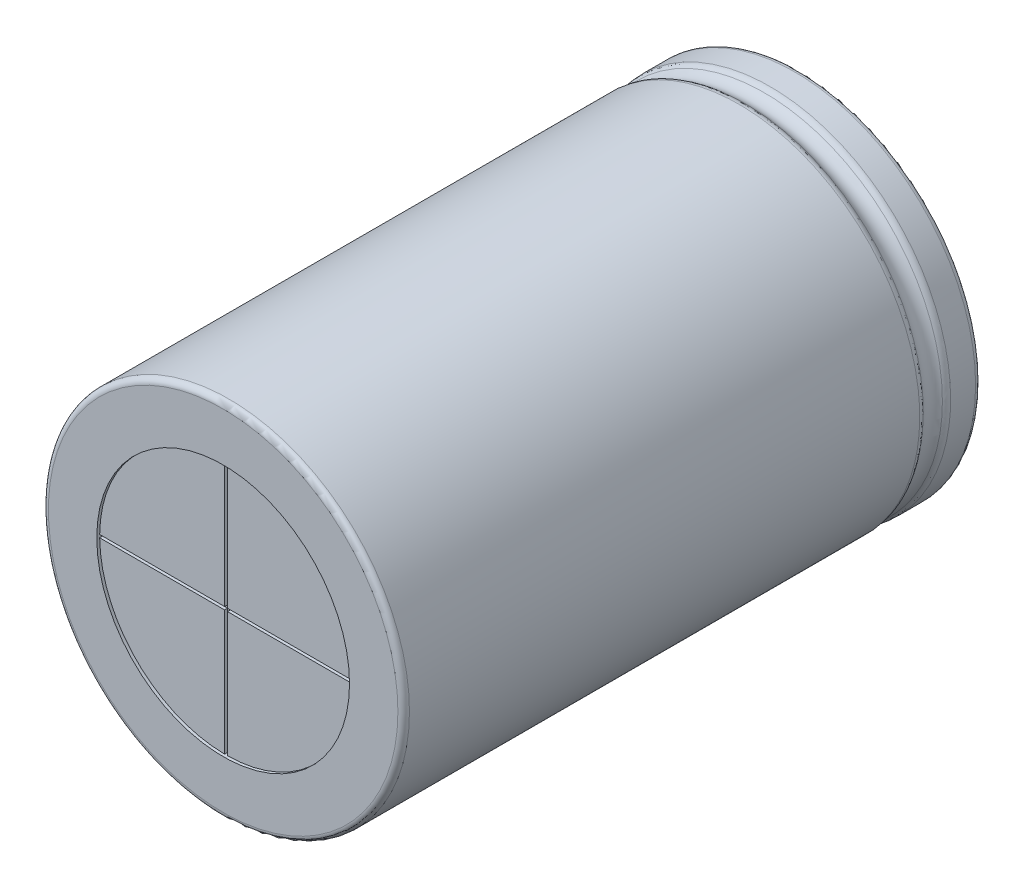
ISO-10303-21;
HEADER;
FILE_DESCRIPTION(('STEP AP214'),'2;1');
FILE_NAME('part.step','',(''),(''),'','','');
FILE_SCHEMA(('AUTOMOTIVE_DESIGN { 1 0 10303 214 1 1 1 1 }'));
ENDSEC;
DATA;
#1=APPLICATION_CONTEXT('core data for automotive mechanical design processes');
#2=APPLICATION_PROTOCOL_DEFINITION('international standard','automotive_design',2000,#1);
#3=PRODUCT_CONTEXT('',#1,'mechanical');
#4=PRODUCT('Part','Part','',(#3));
#5=PRODUCT_RELATED_PRODUCT_CATEGORY('part','',(#4));
#6=PRODUCT_DEFINITION_FORMATION('','',#4);
#7=PRODUCT_DEFINITION_CONTEXT('part definition',#1,'design');
#8=PRODUCT_DEFINITION('design','',#6,#7);
#9=PRODUCT_DEFINITION_SHAPE('','',#8);
#10=(LENGTH_UNIT() NAMED_UNIT(*) SI_UNIT(.MILLI.,.METRE.));
#11=(NAMED_UNIT(*) PLANE_ANGLE_UNIT() SI_UNIT($,.RADIAN.));
#12=(NAMED_UNIT(*) SI_UNIT($,.STERADIAN.) SOLID_ANGLE_UNIT());
#13=UNCERTAINTY_MEASURE_WITH_UNIT(LENGTH_MEASURE(1.E-05),#10,'distance_accuracy_value','');
#14=(GEOMETRIC_REPRESENTATION_CONTEXT(3) GLOBAL_UNCERTAINTY_ASSIGNED_CONTEXT((#13)) GLOBAL_UNIT_ASSIGNED_CONTEXT((#10,
#11,#12)) REPRESENTATION_CONTEXT('',''));
#15=CARTESIAN_POINT('',(0.,0.,0.));
#16=DIRECTION('',(0.,0.,1.));
#17=DIRECTION('',(1.,0.,0.));
#18=AXIS2_PLACEMENT_3D('',#15,#16,#17);
#19=CARTESIAN_POINT('',(71.,22.1,-0.4));
#20=DIRECTION('',(0.,0.,1.));
#21=DIRECTION('',(1.,0.,0.));
#22=AXIS2_PLACEMENT_3D('',#19,#20,#21);
#23=PLANE('',#22);
#24=CARTESIAN_POINT('',(71.,22.1,-0.4));
#25=DIRECTION('',(0.,0.,1.));
#26=DIRECTION('',(1.,0.,0.));
#27=AXIS2_PLACEMENT_3D('',#24,#25,#26);
#28=CIRCLE('',#27,0.3);
#29=CARTESIAN_POINT('',(71.3,22.1,-0.4));
#30=VERTEX_POINT('',#29);
#31=EDGE_CURVE('E425',#30,#30,#28,.T.);
#32=ORIENTED_EDGE('',*,*,#31,.F.);
#33=EDGE_LOOP('',(#32));
#34=FACE_BOUND('',#33,.T.);
#35=ADVANCED_FACE('F18',(#34),#23,.F.);
#36=CARTESIAN_POINT('',(66.,22.1,-0.5));
#37=DIRECTION('',(0.,0.,1.));
#38=DIRECTION('',(1.,0.,0.));
#39=AXIS2_PLACEMENT_3D('',#36,#37,#38);
#40=PLANE('',#39);
#41=CARTESIAN_POINT('',(66.,22.1,-0.5));
#42=DIRECTION('',(0.,0.,1.));
#43=DIRECTION('',(1.,0.,0.));
#44=AXIS2_PLACEMENT_3D('',#41,#42,#43);
#45=CIRCLE('',#44,0.3);
#46=CARTESIAN_POINT('',(66.3,22.1,-0.5));
#47=VERTEX_POINT('',#46);
#48=EDGE_CURVE('E422',#47,#47,#45,.T.);
#49=ORIENTED_EDGE('',*,*,#48,.F.);
#50=EDGE_LOOP('',(#49));
#51=FACE_BOUND('',#50,.T.);
#52=ADVANCED_FACE('F180',(#51),#40,.F.);
#53=CARTESIAN_POINT('',(71.,22.1,1.8));
#54=DIRECTION('',(0.,0.,1.));
#55=DIRECTION('',(1.,0.,0.));
#56=AXIS2_PLACEMENT_3D('',#53,#54,#55);
#57=CYLINDRICAL_SURFACE('',#56,0.3);
#58=ORIENTED_EDGE('',*,*,#31,.T.);
#59=EDGE_LOOP('',(#58));
#60=FACE_BOUND('',#59,.T.);
#61=CARTESIAN_POINT('',(71.,22.1,1.7));
#62=DIRECTION('',(0.,0.,1.));
#63=DIRECTION('',(1.,0.,0.));
#64=AXIS2_PLACEMENT_3D('',#61,#62,#63);
#65=CIRCLE('',#64,0.3);
#66=CARTESIAN_POINT('',(71.3,22.1,1.7));
#67=VERTEX_POINT('',#66);
#68=EDGE_CURVE('E419',#67,#67,#65,.F.);
#69=ORIENTED_EDGE('',*,*,#68,.T.);
#70=EDGE_LOOP('',(#69));
#71=FACE_BOUND('',#70,.T.);
#72=ADVANCED_FACE('F177',(#60,#71),#57,.T.);
#73=CARTESIAN_POINT('',(66.,22.1,1.8));
#74=DIRECTION('',(0.,0.,1.));
#75=DIRECTION('',(1.,0.,0.));
#76=AXIS2_PLACEMENT_3D('',#73,#74,#75);
#77=CYLINDRICAL_SURFACE('',#76,0.3);
#78=ORIENTED_EDGE('',*,*,#48,.T.);
#79=EDGE_LOOP('',(#78));
#80=FACE_BOUND('',#79,.T.);
#81=CARTESIAN_POINT('',(66.,22.1,1.7));
#82=DIRECTION('',(0.,0.,1.));
#83=DIRECTION('',(1.,0.,0.));
#84=AXIS2_PLACEMENT_3D('',#81,#82,#83);
#85=CIRCLE('',#84,0.3);
#86=CARTESIAN_POINT('',(66.3,22.1,1.7));
#87=VERTEX_POINT('',#86);
#88=EDGE_CURVE('E416',#87,#87,#85,.F.);
#89=ORIENTED_EDGE('',*,*,#88,.T.);
#90=EDGE_LOOP('',(#89));
#91=FACE_BOUND('',#90,.T.);
#92=ADVANCED_FACE('F173',(#80,#91),#77,.T.);
#93=CARTESIAN_POINT('',(68.5,22.1,1.7));
#94=DIRECTION('',(0.,0.,1.));
#95=DIRECTION('',(1.,0.,0.));
#96=AXIS2_PLACEMENT_3D('',#93,#94,#95);
#97=PLANE('',#96);
#98=ORIENTED_EDGE('',*,*,#88,.F.);
#99=EDGE_LOOP('',(#98));
#100=FACE_BOUND('',#99,.T.);
#101=ORIENTED_EDGE('',*,*,#68,.F.);
#102=EDGE_LOOP('',(#101));
#103=FACE_BOUND('',#102,.T.);
#104=CARTESIAN_POINT('',(68.5,22.1,1.7));
#105=DIRECTION('',(0.,0.,-1.));
#106=DIRECTION('',(-1.,0.,0.));
#107=AXIS2_PLACEMENT_3D('',#104,#105,#106);
#108=CIRCLE('',#107,4.375);
#109=CARTESIAN_POINT('',(64.125,22.1,1.7));
#110=VERTEX_POINT('',#109);
#111=EDGE_CURVE('E413',#110,#110,#108,.T.);
#112=ORIENTED_EDGE('',*,*,#111,.T.);
#113=EDGE_LOOP('',(#112));
#114=FACE_BOUND('',#113,.T.);
#115=ADVANCED_FACE('F169',(#100,#103,#114),#97,.F.);
#116=CARTESIAN_POINT('',(68.5,22.1,1.8));
#117=DIRECTION('',(0.,0.,-1.));
#118=DIRECTION('',(-1.,0.,0.));
#119=AXIS2_PLACEMENT_3D('',#116,#117,#118);
#120=CYLINDRICAL_SURFACE('',#119,4.375);
#121=CARTESIAN_POINT('',(68.5,22.1,1.5));
#122=DIRECTION('',(0.,0.,-1.));
#123=DIRECTION('',(-1.,0.,0.));
#124=AXIS2_PLACEMENT_3D('',#121,#122,#123);
#125=CIRCLE('',#124,4.375);
#126=CARTESIAN_POINT('',(64.125,22.1,1.5));
#127=VERTEX_POINT('',#126);
#128=EDGE_CURVE('E127',#127,#127,#125,.F.);
#129=ORIENTED_EDGE('',*,*,#128,.F.);
#130=EDGE_LOOP('',(#129));
#131=FACE_BOUND('',#130,.T.);
#132=ORIENTED_EDGE('',*,*,#111,.F.);
#133=EDGE_LOOP('',(#132));
#134=FACE_BOUND('',#133,.T.);
#135=ADVANCED_FACE('F166',(#131,#134),#120,.F.);
#136=CARTESIAN_POINT('',(68.5,22.1,21.3));
#137=DIRECTION('',(0.,0.,1.));
#138=DIRECTION('',(1.,0.,0.));
#139=AXIS2_PLACEMENT_3D('',#136,#137,#138);
#140=PLANE('',#139);
#141=DIRECTION('',(-1.,0.,0.));
#142=VECTOR('',#141,1.);
#143=CARTESIAN_POINT('',(68.45,22.15,21.3));
#144=LINE('',#143,#142);
#145=CARTESIAN_POINT('',(68.45,22.15,21.3));
#146=VERTEX_POINT('',#145);
#147=CARTESIAN_POINT('',(64.1252857236159,22.15,21.3));
#148=VERTEX_POINT('',#147);
#149=EDGE_CURVE('E133',#146,#148,#144,.T.);
#150=ORIENTED_EDGE('',*,*,#149,.T.);
#151=CARTESIAN_POINT('',(68.5,22.1,21.3));
#152=DIRECTION('',(0.,0.,1.));
#153=DIRECTION('',(1.,0.,0.));
#154=AXIS2_PLACEMENT_3D('',#151,#152,#153);
#155=CIRCLE('',#154,4.375);
#156=CARTESIAN_POINT('',(64.1252857236159,22.05,21.3));
#157=VERTEX_POINT('',#156);
#158=EDGE_CURVE('E385',#148,#157,#155,.T.);
#159=ORIENTED_EDGE('',*,*,#158,.T.);
#160=DIRECTION('',(1.,0.,0.));
#161=VECTOR('',#160,1.);
#162=CARTESIAN_POINT('',(55.95,22.05,21.3));
#163=LINE('',#162,#161);
#164=CARTESIAN_POINT('',(68.45,22.05,21.3));
#165=VERTEX_POINT('',#164);
#166=EDGE_CURVE('E92',#157,#165,#163,.T.);
#167=ORIENTED_EDGE('',*,*,#166,.T.);
#168=DIRECTION('',(0.,-1.,0.));
#169=VECTOR('',#168,1.);
#170=CARTESIAN_POINT('',(68.45,22.05,21.3));
#171=LINE('',#170,#169);
#172=CARTESIAN_POINT('',(68.45,17.7252857236159,21.3));
#173=VERTEX_POINT('',#172);
#174=EDGE_CURVE('E367',#165,#173,#171,.T.);
#175=ORIENTED_EDGE('',*,*,#174,.T.);
#176=CARTESIAN_POINT('',(68.5,22.1,21.3));
#177=DIRECTION('',(0.,0.,1.));
#178=DIRECTION('',(1.,0.,0.));
#179=AXIS2_PLACEMENT_3D('',#176,#177,#178);
#180=CIRCLE('',#179,4.375);
#181=CARTESIAN_POINT('',(68.55,17.7252857236159,21.3));
#182=VERTEX_POINT('',#181);
#183=EDGE_CURVE('E85',#173,#182,#180,.T.);
#184=ORIENTED_EDGE('',*,*,#183,.T.);
#185=DIRECTION('',(0.,1.,0.));
#186=VECTOR('',#185,1.);
#187=CARTESIAN_POINT('',(68.55,9.55,21.3));
#188=LINE('',#187,#186);
#189=CARTESIAN_POINT('',(68.55,22.05,21.3));
#190=VERTEX_POINT('',#189);
#191=EDGE_CURVE('E360',#182,#190,#188,.T.);
#192=ORIENTED_EDGE('',*,*,#191,.T.);
#193=DIRECTION('',(1.,0.,0.));
#194=VECTOR('',#193,1.);
#195=CARTESIAN_POINT('',(68.55,22.05,21.3));
#196=LINE('',#195,#194);
#197=CARTESIAN_POINT('',(72.8747142763841,22.05,21.3));
#198=VERTEX_POINT('',#197);
#199=EDGE_CURVE('E356',#190,#198,#196,.T.);
#200=ORIENTED_EDGE('',*,*,#199,.T.);
#201=CARTESIAN_POINT('',(68.5,22.1,21.3));
#202=DIRECTION('',(0.,0.,1.));
#203=DIRECTION('',(1.,0.,0.));
#204=AXIS2_PLACEMENT_3D('',#201,#202,#203);
#205=CIRCLE('',#204,4.375);
#206=CARTESIAN_POINT('',(72.8747142763841,22.15,21.3));
#207=VERTEX_POINT('',#206);
#208=EDGE_CURVE('E116',#198,#207,#205,.T.);
#209=ORIENTED_EDGE('',*,*,#208,.T.);
#210=DIRECTION('',(-1.,0.,0.));
#211=VECTOR('',#210,1.);
#212=CARTESIAN_POINT('',(81.05,22.15,21.3));
#213=LINE('',#212,#211);
#214=CARTESIAN_POINT('',(68.55,22.15,21.3));
#215=VERTEX_POINT('',#214);
#216=EDGE_CURVE('E108',#207,#215,#213,.T.);
#217=ORIENTED_EDGE('',*,*,#216,.T.);
#218=DIRECTION('',(0.,1.,0.));
#219=VECTOR('',#218,1.);
#220=CARTESIAN_POINT('',(68.55,22.15,21.3));
#221=LINE('',#220,#219);
#222=CARTESIAN_POINT('',(68.55,26.4747142763841,21.3));
#223=VERTEX_POINT('',#222);
#224=EDGE_CURVE('E113',#215,#223,#221,.T.);
#225=ORIENTED_EDGE('',*,*,#224,.T.);
#226=CARTESIAN_POINT('',(68.5,22.1,21.3));
#227=DIRECTION('',(0.,0.,1.));
#228=DIRECTION('',(1.,0.,0.));
#229=AXIS2_PLACEMENT_3D('',#226,#227,#228);
#230=CIRCLE('',#229,4.375);
#231=CARTESIAN_POINT('',(68.45,26.4747142763841,21.3));
#232=VERTEX_POINT('',#231);
#233=EDGE_CURVE('E409',#223,#232,#230,.T.);
#234=ORIENTED_EDGE('',*,*,#233,.T.);
#235=DIRECTION('',(0.,-1.,0.));
#236=VECTOR('',#235,1.);
#237=CARTESIAN_POINT('',(68.45,34.65,21.3));
#238=LINE('',#237,#236);
#239=EDGE_CURVE('E377',#232,#146,#238,.T.);
#240=ORIENTED_EDGE('',*,*,#239,.T.);
#241=EDGE_LOOP('',(#150,#159,#167,#175,#184,#192,#200,#209,#217,#225,#234,#240));
#242=FACE_BOUND('',#241,.T.);
#243=ADVANCED_FACE('F111',(#242),#140,.T.);
#244=CARTESIAN_POINT('',(68.5,22.1,1.5));
#245=DIRECTION('',(0.,0.,-1.));
#246=DIRECTION('',(-1.,0.,0.));
#247=AXIS2_PLACEMENT_3D('',#244,#245,#246);
#248=PLANE('',#247);
#249=CARTESIAN_POINT('',(68.5,22.1,1.5));
#250=DIRECTION('',(0.,0.,1.));
#251=DIRECTION('',(1.,0.,0.));
#252=AXIS2_PLACEMENT_3D('',#249,#250,#251);
#253=CIRCLE('',#252,6.05);
#254=CARTESIAN_POINT('',(74.55,22.1,1.5));
#255=VERTEX_POINT('',#254);
#256=EDGE_CURVE('E147',#255,#255,#253,.F.);
#257=ORIENTED_EDGE('',*,*,#256,.T.);
#258=EDGE_LOOP('',(#257));
#259=FACE_BOUND('',#258,.T.);
#260=ORIENTED_EDGE('',*,*,#128,.T.);
#261=EDGE_LOOP('',(#260));
#262=FACE_BOUND('',#261,.T.);
#263=ADVANCED_FACE('F153',(#259,#262),#248,.T.);
#264=CARTESIAN_POINT('',(68.55,22.15,21.4));
#265=DIRECTION('',(1.,0.,0.));
#266=DIRECTION('',(0.,1.,0.));
#267=AXIS2_PLACEMENT_3D('',#264,#265,#266);
#268=PLANE('',#267);
#269=ORIENTED_EDGE('',*,*,#224,.F.);
#270=DIRECTION('',(0.,0.,1.));
#271=VECTOR('',#270,1.);
#272=CARTESIAN_POINT('',(68.55,22.15,21.4));
#273=LINE('',#272,#271);
#274=CARTESIAN_POINT('',(68.55,22.15,21.4));
#275=VERTEX_POINT('',#274);
#276=EDGE_CURVE('E119',#215,#275,#273,.T.);
#277=ORIENTED_EDGE('',*,*,#276,.T.);
#278=DIRECTION('',(0.,1.,0.));
#279=VECTOR('',#278,1.);
#280=CARTESIAN_POINT('',(68.55,22.1,21.4));
#281=LINE('',#280,#279);
#282=CARTESIAN_POINT('',(68.55,26.4747142763841,21.4));
#283=VERTEX_POINT('',#282);
#284=EDGE_CURVE('E796',#283,#275,#281,.F.);
#285=ORIENTED_EDGE('',*,*,#284,.F.);
#286=DIRECTION('',(0.,0.,1.));
#287=VECTOR('',#286,1.);
#288=CARTESIAN_POINT('',(68.55,26.474714276384,21.4));
#289=LINE('',#288,#287);
#290=EDGE_CURVE('E126',#223,#283,#289,.T.);
#291=ORIENTED_EDGE('',*,*,#290,.F.);
#292=EDGE_LOOP('',(#269,#277,#285,#291));
#293=FACE_BOUND('',#292,.T.);
#294=ADVANCED_FACE('F123',(#293),#268,.F.);
#295=CARTESIAN_POINT('',(81.05,22.15,21.4));
#296=DIRECTION('',(0.,1.,0.));
#297=DIRECTION('',(-1.,0.,0.));
#298=AXIS2_PLACEMENT_3D('',#295,#296,#297);
#299=PLANE('',#298);
#300=ORIENTED_EDGE('',*,*,#216,.F.);
#301=DIRECTION('',(0.,0.,1.));
#302=VECTOR('',#301,1.);
#303=CARTESIAN_POINT('',(72.874714276384,22.15,21.4));
#304=LINE('',#303,#302);
#305=CARTESIAN_POINT('',(72.8747142763841,22.15,21.4));
#306=VERTEX_POINT('',#305);
#307=EDGE_CURVE('E120',#306,#207,#304,.F.);
#308=ORIENTED_EDGE('',*,*,#307,.F.);
#309=DIRECTION('',(1.,0.,0.));
#310=VECTOR('',#309,1.);
#311=CARTESIAN_POINT('',(68.5,22.15,21.4));
#312=LINE('',#311,#310);
#313=EDGE_CURVE('E131',#275,#306,#312,.T.);
#314=ORIENTED_EDGE('',*,*,#313,.F.);
#315=ORIENTED_EDGE('',*,*,#276,.F.);
#316=EDGE_LOOP('',(#300,#308,#314,#315));
#317=FACE_BOUND('',#316,.T.);
#318=ADVANCED_FACE('F129',(#317),#299,.F.);
#319=CARTESIAN_POINT('',(68.45,22.15,21.4));
#320=DIRECTION('',(0.,1.,0.));
#321=DIRECTION('',(-1.,0.,0.));
#322=AXIS2_PLACEMENT_3D('',#319,#320,#321);
#323=PLANE('',#322);
#324=ORIENTED_EDGE('',*,*,#149,.F.);
#325=DIRECTION('',(0.,0.,1.));
#326=VECTOR('',#325,1.);
#327=CARTESIAN_POINT('',(68.45,22.15,21.4));
#328=LINE('',#327,#326);
#329=CARTESIAN_POINT('',(68.45,22.15,21.4));
#330=VERTEX_POINT('',#329);
#331=EDGE_CURVE('E374',#146,#330,#328,.T.);
#332=ORIENTED_EDGE('',*,*,#331,.T.);
#333=DIRECTION('',(1.,0.,0.));
#334=VECTOR('',#333,1.);
#335=CARTESIAN_POINT('',(68.5,22.15,21.4));
#336=LINE('',#335,#334);
#337=CARTESIAN_POINT('',(64.1252857236159,22.15,21.4));
#338=VERTEX_POINT('',#337);
#339=EDGE_CURVE('E389',#338,#330,#336,.T.);
#340=ORIENTED_EDGE('',*,*,#339,.F.);
#341=DIRECTION('',(0.,0.,1.));
#342=VECTOR('',#341,1.);
#343=CARTESIAN_POINT('',(64.125285723616,22.15,21.4));
#344=LINE('',#343,#342);
#345=EDGE_CURVE('E135',#148,#338,#344,.T.);
#346=ORIENTED_EDGE('',*,*,#345,.F.);
#347=EDGE_LOOP('',(#324,#332,#340,#346));
#348=FACE_BOUND('',#347,.T.);
#349=ADVANCED_FACE('F390',(#348),#323,.F.);
#350=CARTESIAN_POINT('',(68.45,34.65,21.4));
#351=DIRECTION('',(-1.,0.,0.));
#352=DIRECTION('',(0.,-1.,0.));
#353=AXIS2_PLACEMENT_3D('',#350,#351,#352);
#354=PLANE('',#353);
#355=ORIENTED_EDGE('',*,*,#239,.F.);
#356=DIRECTION('',(0.,0.,1.));
#357=VECTOR('',#356,1.);
#358=CARTESIAN_POINT('',(68.45,26.474714276384,21.4));
#359=LINE('',#358,#357);
#360=CARTESIAN_POINT('',(68.45,26.4747142763841,21.4));
#361=VERTEX_POINT('',#360);
#362=EDGE_CURVE('E375',#361,#232,#359,.F.);
#363=ORIENTED_EDGE('',*,*,#362,.F.);
#364=DIRECTION('',(0.,1.,0.));
#365=VECTOR('',#364,1.);
#366=CARTESIAN_POINT('',(68.45,22.1,21.4));
#367=LINE('',#366,#365);
#368=EDGE_CURVE('E394',#330,#361,#367,.T.);
#369=ORIENTED_EDGE('',*,*,#368,.F.);
#370=ORIENTED_EDGE('',*,*,#331,.F.);
#371=EDGE_LOOP('',(#355,#363,#369,#370));
#372=FACE_BOUND('',#371,.T.);
#373=ADVANCED_FACE('F599',(#372),#354,.F.);
#374=CARTESIAN_POINT('',(55.95,22.05,21.4));
#375=DIRECTION('',(0.,-1.,0.));
#376=DIRECTION('',(1.,0.,0.));
#377=AXIS2_PLACEMENT_3D('',#374,#375,#376);
#378=PLANE('',#377);
#379=ORIENTED_EDGE('',*,*,#166,.F.);
#380=DIRECTION('',(0.,0.,1.));
#381=VECTOR('',#380,1.);
#382=CARTESIAN_POINT('',(64.125285723616,22.05,21.4));
#383=LINE('',#382,#381);
#384=CARTESIAN_POINT('',(64.1252857236159,22.05,21.4));
#385=VERTEX_POINT('',#384);
#386=EDGE_CURVE('E372',#385,#157,#383,.F.);
#387=ORIENTED_EDGE('',*,*,#386,.F.);
#388=DIRECTION('',(1.,0.,0.));
#389=VECTOR('',#388,1.);
#390=CARTESIAN_POINT('',(68.5,22.05,21.4));
#391=LINE('',#390,#389);
#392=CARTESIAN_POINT('',(68.45,22.05,21.4));
#393=VERTEX_POINT('',#392);
#394=EDGE_CURVE('E778',#393,#385,#391,.F.);
#395=ORIENTED_EDGE('',*,*,#394,.F.);
#396=DIRECTION('',(0.,0.,1.));
#397=VECTOR('',#396,1.);
#398=CARTESIAN_POINT('',(68.45,22.05,21.4));
#399=LINE('',#398,#397);
#400=EDGE_CURVE('E368',#393,#165,#399,.F.);
#401=ORIENTED_EDGE('',*,*,#400,.T.);
#402=EDGE_LOOP('',(#379,#387,#395,#401));
#403=FACE_BOUND('',#402,.T.);
#404=ADVANCED_FACE('F589',(#403),#378,.F.);
#405=CARTESIAN_POINT('',(68.45,22.05,21.4));
#406=DIRECTION('',(-1.,0.,0.));
#407=DIRECTION('',(0.,-1.,0.));
#408=AXIS2_PLACEMENT_3D('',#405,#406,#407);
#409=PLANE('',#408);
#410=ORIENTED_EDGE('',*,*,#174,.F.);
#411=ORIENTED_EDGE('',*,*,#400,.F.);
#412=DIRECTION('',(0.,1.,0.));
#413=VECTOR('',#412,1.);
#414=CARTESIAN_POINT('',(68.45,22.1,21.4));
#415=LINE('',#414,#413);
#416=CARTESIAN_POINT('',(68.45,17.7252857236159,21.4));
#417=VERTEX_POINT('',#416);
#418=EDGE_CURVE('E775',#417,#393,#415,.T.);
#419=ORIENTED_EDGE('',*,*,#418,.F.);
#420=DIRECTION('',(0.,0.,1.));
#421=VECTOR('',#420,1.);
#422=CARTESIAN_POINT('',(68.45,17.725285723616,21.4));
#423=LINE('',#422,#421);
#424=EDGE_CURVE('E365',#173,#417,#423,.T.);
#425=ORIENTED_EDGE('',*,*,#424,.F.);
#426=EDGE_LOOP('',(#410,#411,#419,#425));
#427=FACE_BOUND('',#426,.T.);
#428=ADVANCED_FACE('F580',(#427),#409,.F.);
#429=CARTESIAN_POINT('',(68.55,9.55,21.4));
#430=DIRECTION('',(1.,0.,0.));
#431=DIRECTION('',(0.,1.,0.));
#432=AXIS2_PLACEMENT_3D('',#429,#430,#431);
#433=PLANE('',#432);
#434=ORIENTED_EDGE('',*,*,#191,.F.);
#435=DIRECTION('',(0.,0.,1.));
#436=VECTOR('',#435,1.);
#437=CARTESIAN_POINT('',(68.55,17.725285723616,21.4));
#438=LINE('',#437,#436);
#439=CARTESIAN_POINT('',(68.55,17.7252857236159,21.4));
#440=VERTEX_POINT('',#439);
#441=EDGE_CURVE('E363',#440,#182,#438,.F.);
#442=ORIENTED_EDGE('',*,*,#441,.F.);
#443=DIRECTION('',(0.,1.,0.));
#444=VECTOR('',#443,1.);
#445=CARTESIAN_POINT('',(68.55,22.1,21.4));
#446=LINE('',#445,#444);
#447=CARTESIAN_POINT('',(68.55,22.05,21.4));
#448=VERTEX_POINT('',#447);
#449=EDGE_CURVE('E748',#448,#440,#446,.F.);
#450=ORIENTED_EDGE('',*,*,#449,.F.);
#451=DIRECTION('',(0.,0.,1.));
#452=VECTOR('',#451,1.);
#453=CARTESIAN_POINT('',(68.55,22.05,21.4));
#454=LINE('',#453,#452);
#455=EDGE_CURVE('E357',#448,#190,#454,.F.);
#456=ORIENTED_EDGE('',*,*,#455,.T.);
#457=EDGE_LOOP('',(#434,#442,#450,#456));
#458=FACE_BOUND('',#457,.T.);
#459=ADVANCED_FACE('F571',(#458),#433,.F.);
#460=CARTESIAN_POINT('',(68.55,22.05,21.4));
#461=DIRECTION('',(0.,-1.,0.));
#462=DIRECTION('',(1.,0.,0.));
#463=AXIS2_PLACEMENT_3D('',#460,#461,#462);
#464=PLANE('',#463);
#465=ORIENTED_EDGE('',*,*,#199,.F.);
#466=ORIENTED_EDGE('',*,*,#455,.F.);
#467=DIRECTION('',(1.,0.,0.));
#468=VECTOR('',#467,1.);
#469=CARTESIAN_POINT('',(68.5,22.05,21.4));
#470=LINE('',#469,#468);
#471=CARTESIAN_POINT('',(72.8747142763841,22.05,21.4));
#472=VERTEX_POINT('',#471);
#473=EDGE_CURVE('E314',#472,#448,#470,.F.);
#474=ORIENTED_EDGE('',*,*,#473,.F.);
#475=DIRECTION('',(0.,0.,1.));
#476=VECTOR('',#475,1.);
#477=CARTESIAN_POINT('',(72.874714276384,22.05,21.4));
#478=LINE('',#477,#476);
#479=EDGE_CURVE('E35',#198,#472,#478,.T.);
#480=ORIENTED_EDGE('',*,*,#479,.F.);
#481=EDGE_LOOP('',(#465,#466,#474,#480));
#482=FACE_BOUND('',#481,.T.);
#483=ADVANCED_FACE('F347',(#482),#464,.F.);
#484=CARTESIAN_POINT('',(68.5,22.1,1.7));
#485=DIRECTION('',(0.,0.,1.));
#486=DIRECTION('',(1.,0.,0.));
#487=AXIS2_PLACEMENT_3D('',#484,#485,#486);
#488=TOROIDAL_SURFACE('',#487,6.05,0.2);
#489=CARTESIAN_POINT('',(68.5,22.1,1.7));
#490=DIRECTION('',(0.,0.,1.));
#491=DIRECTION('',(1.,0.,0.));
#492=AXIS2_PLACEMENT_3D('',#489,#490,#491);
#493=CIRCLE('',#492,6.25);
#494=CARTESIAN_POINT('',(74.75,22.1,1.7));
#495=VERTEX_POINT('',#494);
#496=EDGE_CURVE('E274',#495,#495,#493,.T.);
#497=ORIENTED_EDGE('',*,*,#496,.F.);
#498=EDGE_LOOP('',(#497));
#499=FACE_BOUND('',#498,.T.);
#500=ORIENTED_EDGE('',*,*,#256,.F.);
#501=EDGE_LOOP('',(#500));
#502=FACE_BOUND('',#501,.T.);
#503=ADVANCED_FACE('F341',(#499,#502),#488,.T.);
#504=CARTESIAN_POINT('',(68.5,22.1,21.4));
#505=DIRECTION('',(0.,0.,1.));
#506=DIRECTION('',(1.,0.,0.));
#507=AXIS2_PLACEMENT_3D('',#504,#505,#506);
#508=PLANE('',#507);
#509=ORIENTED_EDGE('',*,*,#284,.T.);
#510=ORIENTED_EDGE('',*,*,#313,.T.);
#511=CARTESIAN_POINT('',(68.5,22.1,21.4));
#512=DIRECTION('',(0.,0.,-1.));
#513=DIRECTION('',(-1.,0.,0.));
#514=AXIS2_PLACEMENT_3D('',#511,#512,#513);
#515=CIRCLE('',#514,4.375);
#516=EDGE_CURVE('E397',#306,#283,#515,.F.);
#517=ORIENTED_EDGE('',*,*,#516,.T.);
#518=EDGE_LOOP('',(#509,#510,#517));
#519=FACE_BOUND('',#518,.T.);
#520=ADVANCED_FACE('F337',(#519),#508,.T.);
#521=CARTESIAN_POINT('',(68.5,22.1,21.4));
#522=DIRECTION('',(0.,0.,1.));
#523=DIRECTION('',(1.,0.,0.));
#524=AXIS2_PLACEMENT_3D('',#521,#522,#523);
#525=PLANE('',#524);
#526=ORIENTED_EDGE('',*,*,#339,.T.);
#527=ORIENTED_EDGE('',*,*,#368,.T.);
#528=CARTESIAN_POINT('',(68.5,22.1,21.4));
#529=DIRECTION('',(0.,0.,-1.));
#530=DIRECTION('',(-1.,0.,0.));
#531=AXIS2_PLACEMENT_3D('',#528,#529,#530);
#532=CIRCLE('',#531,4.375);
#533=EDGE_CURVE('E384',#361,#338,#532,.F.);
#534=ORIENTED_EDGE('',*,*,#533,.T.);
#535=EDGE_LOOP('',(#526,#527,#534));
#536=FACE_BOUND('',#535,.T.);
#537=ADVANCED_FACE('F333',(#536),#525,.T.);
#538=CARTESIAN_POINT('',(68.5,22.1,21.4));
#539=DIRECTION('',(0.,0.,1.));
#540=DIRECTION('',(1.,0.,0.));
#541=AXIS2_PLACEMENT_3D('',#538,#539,#540);
#542=PLANE('',#541);
#543=CARTESIAN_POINT('',(68.5,22.1,21.4));
#544=DIRECTION('',(0.,0.,-1.));
#545=DIRECTION('',(-1.,0.,0.));
#546=AXIS2_PLACEMENT_3D('',#543,#544,#545);
#547=CIRCLE('',#546,4.375);
#548=EDGE_CURVE('E396',#385,#417,#547,.F.);
#549=ORIENTED_EDGE('',*,*,#548,.T.);
#550=ORIENTED_EDGE('',*,*,#418,.T.);
#551=ORIENTED_EDGE('',*,*,#394,.T.);
#552=EDGE_LOOP('',(#549,#550,#551));
#553=FACE_BOUND('',#552,.T.);
#554=ADVANCED_FACE('F329',(#553),#542,.T.);
#555=CARTESIAN_POINT('',(68.5,22.1,21.4));
#556=DIRECTION('',(0.,0.,1.));
#557=DIRECTION('',(1.,0.,0.));
#558=AXIS2_PLACEMENT_3D('',#555,#556,#557);
#559=PLANE('',#558);
#560=CARTESIAN_POINT('',(68.5,22.1,21.4));
#561=DIRECTION('',(0.,0.,-1.));
#562=DIRECTION('',(-1.,0.,0.));
#563=AXIS2_PLACEMENT_3D('',#560,#561,#562);
#564=CIRCLE('',#563,4.375);
#565=EDGE_CURVE('E400',#440,#472,#564,.F.);
#566=ORIENTED_EDGE('',*,*,#565,.T.);
#567=ORIENTED_EDGE('',*,*,#473,.T.);
#568=ORIENTED_EDGE('',*,*,#449,.T.);
#569=EDGE_LOOP('',(#566,#567,#568));
#570=FACE_BOUND('',#569,.T.);
#571=ADVANCED_FACE('F325',(#570),#559,.T.);
#572=CARTESIAN_POINT('',(68.5,22.1,1.7));
#573=DIRECTION('',(0.,0.,1.));
#574=DIRECTION('',(1.,0.,0.));
#575=AXIS2_PLACEMENT_3D('',#572,#573,#574);
#576=CYLINDRICAL_SURFACE('',#575,6.25);
#577=ORIENTED_EDGE('',*,*,#496,.T.);
#578=EDGE_LOOP('',(#577));
#579=FACE_BOUND('',#578,.T.);
#580=CARTESIAN_POINT('',(74.75,22.1,2.564979142851));
#581=CARTESIAN_POINT('',(74.750000000001,24.864417237132,2.564979142851));
#582=CARTESIAN_POINT('',(73.43345029962,27.687680207852,2.564979142851));
#583=CARTESIAN_POINT('',(70.707510898034,29.833925513807,2.564979142851));
#584=CARTESIAN_POINT('',(66.989525682902,30.539508903953,2.564979142851));
#585=CARTESIAN_POINT('',(63.13812063855,29.142866187284,2.564979142851));
#586=CARTESIAN_POINT('',(60.55445477653,26.377607477066,2.564979142852));
#587=CARTESIAN_POINT('',(58.92000274163,22.100000000032,2.564979142851));
#588=CARTESIAN_POINT('',(60.554454776533,17.822392522879,2.564979142852));
#589=CARTESIAN_POINT('',(63.13812063855,15.057133812752,2.564979142851));
#590=CARTESIAN_POINT('',(66.989525682896,13.660491096029,2.564979142851));
#591=CARTESIAN_POINT('',(70.70751089804,14.366074486202,2.564979142851));
#592=CARTESIAN_POINT('',(73.433450299616,16.512319792144,2.564979142851));
#593=CARTESIAN_POINT('',(74.750000000002,19.335582762869,2.564979142851));
#594=CARTESIAN_POINT('',(74.75,22.1,2.564979142851));
#595=(BOUNDED_CURVE() B_SPLINE_CURVE(14,(#580,#581,#582,#583,#584,#585,#586,#587,#588,#589,#590,
#591,#592,#593,#594),.UNSPECIFIED.,.T.,.F.) B_SPLINE_CURVE_WITH_KNOTS((15,15),(0.,
39.269908169872),
.UNSPECIFIED.) CURVE() GEOMETRIC_REPRESENTATION_ITEM() RATIONAL_B_SPLINE_CURVE((1.,1.,1.,1.,
1.000000000001,0.999999999998,1.000000000003,0.999999999996,1.000000000004,0.999999999996,
1.000000000003,0.999999999999,1.,1.,1.)) REPRESENTATION_ITEM(''));
#596=CARTESIAN_POINT('',(74.75,22.1,2.564979142851));
#597=VERTEX_POINT('',#596);
#598=EDGE_CURVE('E310',#597,#597,#595,.T.);
#599=ORIENTED_EDGE('',*,*,#598,.F.);
#600=EDGE_LOOP('',(#599));
#601=FACE_BOUND('',#600,.T.);
#602=ADVANCED_FACE('F316',(#579,#601),#576,.T.);
#603=CARTESIAN_POINT('',(68.5,22.1,21.5));
#604=DIRECTION('',(0.,0.,-1.));
#605=DIRECTION('',(-1.,0.,0.));
#606=AXIS2_PLACEMENT_3D('',#603,#604,#605);
#607=CYLINDRICAL_SURFACE('',#606,4.375);
#608=CARTESIAN_POINT('',(68.5,22.1,21.5));
#609=DIRECTION('',(0.,0.,-1.));
#610=DIRECTION('',(-1.,0.,0.));
#611=AXIS2_PLACEMENT_3D('',#608,#609,#610);
#612=CIRCLE('',#611,4.375);
#613=CARTESIAN_POINT('',(64.125,22.1,21.5));
#614=VERTEX_POINT('',#613);
#615=EDGE_CURVE('E741',#614,#614,#612,.F.);
#616=ORIENTED_EDGE('',*,*,#615,.T.);
#617=EDGE_LOOP('',(#616));
#618=FACE_BOUND('',#617,.T.);
#619=ORIENTED_EDGE('',*,*,#479,.T.);
#620=ORIENTED_EDGE('',*,*,#565,.F.);
#621=ORIENTED_EDGE('',*,*,#441,.T.);
#622=ORIENTED_EDGE('',*,*,#183,.F.);
#623=ORIENTED_EDGE('',*,*,#424,.T.);
#624=ORIENTED_EDGE('',*,*,#548,.F.);
#625=ORIENTED_EDGE('',*,*,#386,.T.);
#626=ORIENTED_EDGE('',*,*,#158,.F.);
#627=ORIENTED_EDGE('',*,*,#345,.T.);
#628=ORIENTED_EDGE('',*,*,#533,.F.);
#629=ORIENTED_EDGE('',*,*,#362,.T.);
#630=ORIENTED_EDGE('',*,*,#233,.F.);
#631=ORIENTED_EDGE('',*,*,#290,.T.);
#632=ORIENTED_EDGE('',*,*,#516,.F.);
#633=ORIENTED_EDGE('',*,*,#307,.T.);
#634=ORIENTED_EDGE('',*,*,#208,.F.);
#635=EDGE_LOOP('',(#619,#620,#621,#622,#623,#624,#625,#626,#627,#628,#629,#630,#631,#632,#633,#634));
#636=FACE_BOUND('',#635,.T.);
#637=ADVANCED_FACE('F288',(#618,#636),#607,.F.);
#638=CARTESIAN_POINT('',(74.75,22.1,2.564979142851));
#639=CARTESIAN_POINT('',(74.750000000002,19.335582762869,2.564979142851));
#640=CARTESIAN_POINT('',(73.433450299616,16.512319792144,2.564979142851));
#641=CARTESIAN_POINT('',(70.70751089804,14.366074486202,2.564979142851));
#642=CARTESIAN_POINT('',(66.989525682896,13.660491096029,2.564979142851));
#643=CARTESIAN_POINT('',(63.13812063855,15.057133812752,2.564979142851));
#644=CARTESIAN_POINT('',(60.554454776533,17.822392522879,2.564979142852));
#645=CARTESIAN_POINT('',(58.92000274163,22.100000000032,2.564979142851));
#646=CARTESIAN_POINT('',(60.55445477653,26.377607477066,2.564979142852));
#647=CARTESIAN_POINT('',(63.13812063855,29.142866187284,2.564979142851));
#648=CARTESIAN_POINT('',(66.989525682902,30.539508903953,2.564979142851));
#649=CARTESIAN_POINT('',(70.707510898034,29.833925513807,2.564979142851));
#650=CARTESIAN_POINT('',(73.43345029962,27.687680207852,2.564979142851));
#651=CARTESIAN_POINT('',(74.750000000001,24.864417237132,2.564979142851));
#652=CARTESIAN_POINT('',(74.75,22.1,2.564979142851));
#653=CARTESIAN_POINT('',(74.75,22.1,2.682962690499));
#654=CARTESIAN_POINT('',(74.750000000003,19.335582762869,2.682962690499));
#655=CARTESIAN_POINT('',(73.433450299614,16.512319792147,2.682962690499));
#656=CARTESIAN_POINT('',(70.707510898044,14.366074486191,2.682962690499));
#657=CARTESIAN_POINT('',(66.9895256829,13.660491096053,2.682962690499));
#658=CARTESIAN_POINT('',(63.138120638527,15.05713381272,2.682962690499));
#659=CARTESIAN_POINT('',(60.554454776579,17.8223925229,2.6829626905));
#660=CARTESIAN_POINT('',(58.920002741572,22.100000000043,2.682962690499));
#661=CARTESIAN_POINT('',(60.55445477657,26.377607477027,2.6829626905));
#662=CARTESIAN_POINT('',(63.138120638534,29.142866187327,2.682962690499));
#663=CARTESIAN_POINT('',(66.989525682901,30.539508903922,2.682962690499));
#664=CARTESIAN_POINT('',(70.707510898039,29.833925513821,2.682962690499));
#665=CARTESIAN_POINT('',(73.433450299616,27.687680207848,2.682962690499));
#666=CARTESIAN_POINT('',(74.750000000002,24.864417237132,2.682962690499));
#667=CARTESIAN_POINT('',(74.75,22.1,2.682962690499));
#668=CARTESIAN_POINT('',(74.669629897377,22.1,2.769338405373));
#669=CARTESIAN_POINT('',(74.669629897379,19.371131002397,2.769338405373));
#670=CARTESIAN_POINT('',(73.370009994517,16.584172981219,2.769338405373));
#671=CARTESIAN_POINT('',(70.679124037655,14.465526708166,2.769338405373));
#672=CARTESIAN_POINT('',(67.008949199032,13.769016567482,2.769338405373));
#673=CARTESIAN_POINT('',(63.207070205685,15.147699553305,2.769338405372));
#674=CARTESIAN_POINT('',(60.656628262119,17.877399203132,2.769338405374));
#675=CARTESIAN_POINT('',(59.043193999695,22.100000000098,2.769338405371));
#676=CARTESIAN_POINT('',(60.656628262113,26.322600796693,2.769338405374));
#677=CARTESIAN_POINT('',(63.20707020569,29.052300446821,2.769338405372));
#678=CARTESIAN_POINT('',(67.008949199033,30.430983432445,2.769338405373));
#679=CARTESIAN_POINT('',(70.679124037651,29.734473291869,2.769338405373));
#680=CARTESIAN_POINT('',(73.370009994519,27.615827018768,2.769338405373));
#681=CARTESIAN_POINT('',(74.669629897378,24.828868997606,2.769338405373));
#682=CARTESIAN_POINT('',(74.669629897377,22.1,2.769338405373));
#683=(BOUNDED_SURFACE() B_SPLINE_SURFACE(2,14,((#638,#639,#640,#641,#642,#643,#644,#645,#646,
#647,#648,#649,#650,#651,#652),(#653,#654,#655,#656,#657,#658,#659,#660,#661,#662,#663,#664,
#665,#666,#667),(#668,#669,#670,#671,#672,#673,#674,#675,#676,#677,#678,#679,#680,#681,#682)),
.UNSPECIFIED.,.F.,.T.,.F.) B_SPLINE_SURFACE_WITH_KNOTS((3,3),(15,15),(0.,39.269908169872),(0.,
39.269908169872),.UNSPECIFIED.) GEOMETRIC_REPRESENTATION_ITEM() RATIONAL_B_SPLINE_SURFACE(((1.,
1.,1.,0.999999999999,1.000000000003,0.999999999996,1.000000000004,0.999999999996,1.000000000003,
0.999999999998,1.000000000001,1.,1.,1.,1.),(0.93061798229,0.930617982289,0.930617982291,
0.930617982287,0.930617982295,0.930617982282,0.9306179823,0.930617982279,0.930617982299,
0.930617982283,0.930617982293,0.930617982288,0.93061798229,0.93061798229,0.93061798229),(1.,1.,
1.,0.999999999999,1.000000000003,0.999999999996,1.000000000004,0.999999999996,1.000000000003,
0.999999999998,1.000000000001,1.,1.,1.,1.))) REPRESENTATION_ITEM('') SURFACE());
#684=CARTESIAN_POINT('',(74.669629897377,22.1,2.769338405373));
#685=CARTESIAN_POINT('',(74.669629897379,19.371131002397,2.769338405373));
#686=CARTESIAN_POINT('',(73.370009994517,16.584172981219,2.769338405373));
#687=CARTESIAN_POINT('',(70.679124037655,14.465526708166,2.769338405373));
#688=CARTESIAN_POINT('',(67.008949199032,13.769016567482,2.769338405373));
#689=CARTESIAN_POINT('',(63.207070205685,15.147699553305,2.769338405372));
#690=CARTESIAN_POINT('',(60.656628262119,17.877399203132,2.769338405374));
#691=CARTESIAN_POINT('',(59.043193999695,22.100000000098,2.769338405371));
#692=CARTESIAN_POINT('',(60.656628262113,26.322600796693,2.769338405374));
#693=CARTESIAN_POINT('',(63.20707020569,29.052300446821,2.769338405372));
#694=CARTESIAN_POINT('',(67.008949199033,30.430983432445,2.769338405373));
#695=CARTESIAN_POINT('',(70.679124037651,29.734473291869,2.769338405373));
#696=CARTESIAN_POINT('',(73.370009994519,27.615827018768,2.769338405373));
#697=CARTESIAN_POINT('',(74.669629897378,24.828868997606,2.769338405373));
#698=CARTESIAN_POINT('',(74.669629897377,22.1,2.769338405373));
#699=(BOUNDED_CURVE() B_SPLINE_CURVE(14,(#684,#685,#686,#687,#688,#689,#690,#691,#692,#693,#694,
#695,#696,#697,#698),.UNSPECIFIED.,.T.,.F.) B_SPLINE_CURVE_WITH_KNOTS((15,15),(0.,
39.269908169872),
.UNSPECIFIED.) CURVE() GEOMETRIC_REPRESENTATION_ITEM() RATIONAL_B_SPLINE_CURVE((1.,1.,1.,
0.999999999999,1.000000000003,0.999999999996,1.000000000004,0.999999999996,1.000000000003,
0.999999999998,1.000000000001,1.,1.,1.,1.)) REPRESENTATION_ITEM(''));
#700=CARTESIAN_POINT('',(74.669629897377,22.1,2.769338405373));
#701=VERTEX_POINT('',#700);
#702=EDGE_CURVE('E259',#701,#701,#699,.T.);
#703=ORIENTED_EDGE('',*,*,#702,.T.);
#704=EDGE_LOOP('',(#703));
#705=FACE_BOUND('',#704,.T.);
#706=ORIENTED_EDGE('',*,*,#598,.T.);
#707=EDGE_LOOP('',(#706));
#708=FACE_BOUND('',#707,.T.);
#709=ADVANCED_FACE('F276',(#705,#708),#683,.T.);
#710=CARTESIAN_POINT('',(68.5,22.1,21.5));
#711=DIRECTION('',(0.,0.,-1.));
#712=DIRECTION('',(-1.,0.,0.));
#713=AXIS2_PLACEMENT_3D('',#710,#711,#712);
#714=PLANE('',#713);
#715=ORIENTED_EDGE('',*,*,#615,.F.);
#716=EDGE_LOOP('',(#715));
#717=FACE_BOUND('',#716,.T.);
#718=CARTESIAN_POINT('',(68.5,22.1,21.5));
#719=DIRECTION('',(0.,0.,-1.));
#720=DIRECTION('',(1.,0.,0.));
#721=AXIS2_PLACEMENT_3D('',#718,#719,#720);
#722=CIRCLE('',#721,6.05);
#723=CARTESIAN_POINT('',(74.55,22.1,21.5));
#724=VERTEX_POINT('',#723);
#725=EDGE_CURVE('E807',#724,#724,#722,.T.);
#726=ORIENTED_EDGE('',*,*,#725,.F.);
#727=EDGE_LOOP('',(#726));
#728=FACE_BOUND('',#727,.T.);
#729=ADVANCED_FACE('F287',(#717,#728),#714,.F.);
#730=CARTESIAN_POINT('',(68.5,22.1,3.1));
#731=DIRECTION('',(0.,0.,1.));
#732=DIRECTION('',(1.,0.,0.));
#733=AXIS2_PLACEMENT_3D('',#730,#731,#732);
#734=TOROIDAL_SURFACE('',#733,6.525,0.485412195974);
#735=ORIENTED_EDGE('',*,*,#702,.F.);
#736=EDGE_LOOP('',(#735));
#737=FACE_BOUND('',#736,.T.);
#738=CARTESIAN_POINT('',(74.669629897377,22.1,3.430661594627));
#739=CARTESIAN_POINT('',(74.669629897377,24.828868997606,3.430661594627));
#740=CARTESIAN_POINT('',(73.370009994522,27.61582701877,3.430661594627));
#741=CARTESIAN_POINT('',(70.679124037644,29.734473291862,3.430661594627));
#742=CARTESIAN_POINT('',(67.008949199048,30.430983432457,3.430661594627));
#743=CARTESIAN_POINT('',(63.207070205664,29.052300446804,3.430661594628));
#744=CARTESIAN_POINT('',(60.656628262149,26.322600796711,3.430661594627));
#745=CARTESIAN_POINT('',(59.043193999654,22.100000000082,3.430661594628));
#746=CARTESIAN_POINT('',(60.656628262158,17.877399203143,3.430661594627));
#747=CARTESIAN_POINT('',(63.207070205656,15.147699553299,3.430661594628));
#748=CARTESIAN_POINT('',(67.008949199049,13.769016567484,3.430661594627));
#749=CARTESIAN_POINT('',(70.679124037647,14.465526708166,3.430661594627));
#750=CARTESIAN_POINT('',(73.37000999452,16.584172981219,3.430661594627));
#751=CARTESIAN_POINT('',(74.669629897378,19.371131002397,3.430661594627));
#752=CARTESIAN_POINT('',(74.669629897377,22.1,3.430661594627));
#753=(BOUNDED_CURVE() B_SPLINE_CURVE(14,(#738,#739,#740,#741,#742,#743,#744,#745,#746,#747,#748,
#749,#750,#751,#752),.UNSPECIFIED.,.T.,.F.) B_SPLINE_CURVE_WITH_KNOTS((15,15),(0.,
39.269908169872),
.UNSPECIFIED.) CURVE() GEOMETRIC_REPRESENTATION_ITEM() RATIONAL_B_SPLINE_CURVE((1.,1.,1.,1.,
1.000000000001,0.999999999998,1.000000000003,0.999999999996,1.000000000004,0.999999999996,
1.000000000003,0.999999999999,1.,1.,1.)) REPRESENTATION_ITEM(''));
#754=CARTESIAN_POINT('',(74.669629897377,22.1,3.430661594627));
#755=VERTEX_POINT('',#754);
#756=EDGE_CURVE('E808',#755,#755,#753,.T.);
#757=ORIENTED_EDGE('',*,*,#756,.F.);
#758=EDGE_LOOP('',(#757));
#759=FACE_BOUND('',#758,.T.);
#760=ADVANCED_FACE('F239',(#737,#759),#734,.F.);
#761=CARTESIAN_POINT('',(68.5,22.1,21.3));
#762=DIRECTION('',(0.,0.,1.));
#763=DIRECTION('',(1.,0.,0.));
#764=AXIS2_PLACEMENT_3D('',#761,#762,#763);
#765=TOROIDAL_SURFACE('',#764,6.05,0.2);
#766=ORIENTED_EDGE('',*,*,#725,.T.);
#767=EDGE_LOOP('',(#766));
#768=FACE_BOUND('',#767,.T.);
#769=CARTESIAN_POINT('',(68.5,22.1,21.3));
#770=DIRECTION('',(0.,0.,1.));
#771=DIRECTION('',(1.,0.,0.));
#772=AXIS2_PLACEMENT_3D('',#769,#770,#771);
#773=CIRCLE('',#772,6.25);
#774=CARTESIAN_POINT('',(74.75,22.1,21.3));
#775=VERTEX_POINT('',#774);
#776=EDGE_CURVE('E27',#775,#775,#773,.F.);
#777=ORIENTED_EDGE('',*,*,#776,.F.);
#778=EDGE_LOOP('',(#777));
#779=FACE_BOUND('',#778,.T.);
#780=ADVANCED_FACE('F199',(#768,#779),#765,.T.);
#781=CARTESIAN_POINT('',(74.669629897377,22.1,3.430661594627));
#782=CARTESIAN_POINT('',(74.669629897378,19.371131002397,3.430661594627));
#783=CARTESIAN_POINT('',(73.37000999452,16.584172981219,3.430661594627));
#784=CARTESIAN_POINT('',(70.679124037647,14.465526708166,3.430661594627));
#785=CARTESIAN_POINT('',(67.008949199049,13.769016567484,3.430661594627));
#786=CARTESIAN_POINT('',(63.207070205656,15.147699553299,3.430661594628));
#787=CARTESIAN_POINT('',(60.656628262158,17.877399203143,3.430661594627));
#788=CARTESIAN_POINT('',(59.043193999654,22.100000000082,3.430661594628));
#789=CARTESIAN_POINT('',(60.656628262149,26.322600796711,3.430661594627));
#790=CARTESIAN_POINT('',(63.207070205664,29.052300446804,3.430661594628));
#791=CARTESIAN_POINT('',(67.008949199048,30.430983432457,3.430661594627));
#792=CARTESIAN_POINT('',(70.679124037644,29.734473291862,3.430661594627));
#793=CARTESIAN_POINT('',(73.370009994522,27.61582701877,3.430661594627));
#794=CARTESIAN_POINT('',(74.669629897377,24.828868997606,3.430661594627));
#795=CARTESIAN_POINT('',(74.669629897377,22.1,3.430661594627));
#796=CARTESIAN_POINT('',(74.75,22.1,3.517037309501));
#797=CARTESIAN_POINT('',(74.750000000002,19.335582762869,3.517037309501));
#798=CARTESIAN_POINT('',(73.433450299615,16.51231979215,3.517037309501));
#799=CARTESIAN_POINT('',(70.70751089804,14.366074486183,3.517037309501));
#800=CARTESIAN_POINT('',(66.989525682909,13.66049109607,3.517037309501));
#801=CARTESIAN_POINT('',(63.13812063851,15.057133812693,3.517037309501));
#802=CARTESIAN_POINT('',(60.554454776602,17.822392522935,3.517037309501));
#803=CARTESIAN_POINT('',(58.920002741546,22.100000000007,3.5170373095));
#804=CARTESIAN_POINT('',(60.554454776593,26.377607477058,3.517037309501));
#805=CARTESIAN_POINT('',(63.138120638517,29.142866187306,3.5170373095));
#806=CARTESIAN_POINT('',(66.989525682911,30.539508903934,3.517037309501));
#807=CARTESIAN_POINT('',(70.707510898035,29.833925513815,3.517037309501));
#808=CARTESIAN_POINT('',(73.433450299618,27.687680207849,3.517037309501));
#809=CARTESIAN_POINT('',(74.750000000001,24.864417237132,3.517037309501));
#810=CARTESIAN_POINT('',(74.75,22.1,3.517037309501));
#811=CARTESIAN_POINT('',(74.75,22.1,3.635020857149));
#812=CARTESIAN_POINT('',(74.750000000001,19.335582762869,3.635020857149));
#813=CARTESIAN_POINT('',(73.433450299618,16.512319792146,3.635020857149));
#814=CARTESIAN_POINT('',(70.707510898034,14.366074486196,3.635020857149));
#815=CARTESIAN_POINT('',(66.989525682908,13.66049109604,3.635020857149));
#816=CARTESIAN_POINT('',(63.138120638532,15.057133812734,3.635020857149));
#817=CARTESIAN_POINT('',(60.554454776554,17.822392522901,3.635020857149));
#818=CARTESIAN_POINT('',(58.92000274161,22.10000000001,3.635020857149));
#819=CARTESIAN_POINT('',(60.554454776547,26.377607477085,3.635020857149));
#820=CARTESIAN_POINT('',(63.138120638538,29.142866187271,3.635020857148));
#821=CARTESIAN_POINT('',(66.989525682909,30.53950890396,3.635020857149));
#822=CARTESIAN_POINT('',(70.70751089803,29.833925513804,3.635020857149));
#823=CARTESIAN_POINT('',(73.433450299621,27.687680207852,3.635020857149));
#824=CARTESIAN_POINT('',(74.750000000001,24.864417237132,3.635020857149));
#825=CARTESIAN_POINT('',(74.75,22.1,3.635020857149));
#826=(BOUNDED_SURFACE() B_SPLINE_SURFACE(2,14,((#781,#782,#783,#784,#785,#786,#787,#788,#789,
#790,#791,#792,#793,#794,#795),(#796,#797,#798,#799,#800,#801,#802,#803,#804,#805,#806,#807,
#808,#809,#810),(#811,#812,#813,#814,#815,#816,#817,#818,#819,#820,#821,#822,#823,#824,#825)),
.UNSPECIFIED.,.F.,.T.,.F.) B_SPLINE_SURFACE_WITH_KNOTS((3,3),(15,15),(0.,39.269908169872),(0.,
39.269908169872),.UNSPECIFIED.) GEOMETRIC_REPRESENTATION_ITEM() RATIONAL_B_SPLINE_SURFACE(((1.,
1.,1.,0.999999999999,1.000000000003,0.999999999996,1.000000000004,0.999999999996,1.000000000003,
0.999999999998,1.000000000001,1.,1.,1.,1.),(0.93061798229,0.930617982289,0.930617982291,
0.930617982287,0.930617982295,0.930617982282,0.9306179823,0.930617982279,0.930617982299,
0.930617982283,0.930617982293,0.930617982288,0.93061798229,0.93061798229,0.93061798229),(1.,1.,
1.,0.999999999999,1.000000000003,0.999999999996,1.000000000004,0.999999999996,1.000000000003,
0.999999999998,1.000000000001,1.,1.,1.,1.))) REPRESENTATION_ITEM('') SURFACE());
#827=CARTESIAN_POINT('',(74.75,22.1,3.635020857149));
#828=CARTESIAN_POINT('',(74.750000000001,19.335582762869,3.635020857149));
#829=CARTESIAN_POINT('',(73.433450299618,16.512319792146,3.635020857149));
#830=CARTESIAN_POINT('',(70.707510898034,14.366074486196,3.635020857149));
#831=CARTESIAN_POINT('',(66.989525682908,13.66049109604,3.635020857149));
#832=CARTESIAN_POINT('',(63.138120638532,15.057133812734,3.635020857149));
#833=CARTESIAN_POINT('',(60.554454776554,17.822392522901,3.635020857149));
#834=CARTESIAN_POINT('',(58.92000274161,22.10000000001,3.635020857149));
#835=CARTESIAN_POINT('',(60.554454776547,26.377607477085,3.635020857149));
#836=CARTESIAN_POINT('',(63.138120638538,29.142866187271,3.635020857148));
#837=CARTESIAN_POINT('',(66.989525682909,30.53950890396,3.635020857149));
#838=CARTESIAN_POINT('',(70.70751089803,29.833925513804,3.635020857149));
#839=CARTESIAN_POINT('',(73.433450299621,27.687680207852,3.635020857149));
#840=CARTESIAN_POINT('',(74.750000000001,24.864417237132,3.635020857149));
#841=CARTESIAN_POINT('',(74.75,22.1,3.635020857149));
#842=(BOUNDED_CURVE() B_SPLINE_CURVE(14,(#827,#828,#829,#830,#831,#832,#833,#834,#835,#836,#837,
#838,#839,#840,#841),.UNSPECIFIED.,.T.,.F.) B_SPLINE_CURVE_WITH_KNOTS((15,15),(0.,
39.269908169872),
.UNSPECIFIED.) CURVE() GEOMETRIC_REPRESENTATION_ITEM() RATIONAL_B_SPLINE_CURVE((1.,1.,1.,
0.999999999999,1.000000000003,0.999999999996,1.000000000004,0.999999999996,1.000000000003,
0.999999999998,1.000000000001,1.,1.,1.,1.)) REPRESENTATION_ITEM(''));
#843=CARTESIAN_POINT('',(74.75,22.1,3.635020857149));
#844=VERTEX_POINT('',#843);
#845=EDGE_CURVE('E11',#844,#844,#842,.F.);
#846=ORIENTED_EDGE('',*,*,#845,.F.);
#847=EDGE_LOOP('',(#846));
#848=FACE_BOUND('',#847,.T.);
#849=ORIENTED_EDGE('',*,*,#756,.T.);
#850=EDGE_LOOP('',(#849));
#851=FACE_BOUND('',#850,.T.);
#852=ADVANCED_FACE('F192',(#848,#851),#826,.T.);
#853=CARTESIAN_POINT('',(68.5,22.1,3.5));
#854=DIRECTION('',(0.,0.,1.));
#855=DIRECTION('',(1.,0.,0.));
#856=AXIS2_PLACEMENT_3D('',#853,#854,#855);
#857=CYLINDRICAL_SURFACE('',#856,6.25);
#858=ORIENTED_EDGE('',*,*,#845,.T.);
#859=EDGE_LOOP('',(#858));
#860=FACE_BOUND('',#859,.T.);
#861=ORIENTED_EDGE('',*,*,#776,.T.);
#862=EDGE_LOOP('',(#861));
#863=FACE_BOUND('',#862,.T.);
#864=ADVANCED_FACE('F190',(#860,#863),#857,.T.);
#865=CLOSED_SHELL('',(#35,#52,#72,#92,#115,#135,#243,#263,#294,#318,#349,#373,#404,#428,#459,
#483,#503,#520,#537,#554,#571,#602,#637,#709,#729,#760,#780,#852,#864));
#866=CARTESIAN_POINT('',(68.5,22.1,21.1));
#867=DIRECTION('',(0.,0.,-1.));
#868=DIRECTION('',(-1.,0.,0.));
#869=AXIS2_PLACEMENT_3D('',#866,#867,#868);
#870=PLANE('',#869);
#871=CARTESIAN_POINT('',(68.5,22.1,21.1));
#872=DIRECTION('',(0.,0.,-1.));
#873=DIRECTION('',(-1.,0.,0.));
#874=AXIS2_PLACEMENT_3D('',#871,#872,#873);
#875=CIRCLE('',#874,4.375);
#876=CARTESIAN_POINT('',(64.125,22.1,21.1));
#877=VERTEX_POINT('',#876);
#878=EDGE_CURVE('E21',#877,#877,#875,.F.);
#879=ORIENTED_EDGE('',*,*,#878,.T.);
#880=EDGE_LOOP('',(#879));
#881=FACE_BOUND('',#880,.T.);
#882=ADVANCED_FACE('F205',(#881),#870,.F.);
#883=CARTESIAN_POINT('',(68.5,22.1,21.5));
#884=DIRECTION('',(0.,0.,-1.));
#885=DIRECTION('',(-1.,0.,0.));
#886=AXIS2_PLACEMENT_3D('',#883,#884,#885);
#887=CYLINDRICAL_SURFACE('',#886,4.375);
#888=ORIENTED_EDGE('',*,*,#878,.F.);
#889=EDGE_LOOP('',(#888));
#890=FACE_BOUND('',#889,.T.);
#891=CARTESIAN_POINT('',(68.5,22.1,21.2));
#892=DIRECTION('',(0.,0.,-1.));
#893=DIRECTION('',(-1.,0.,0.));
#894=AXIS2_PLACEMENT_3D('',#891,#892,#893);
#895=CIRCLE('',#894,4.375);
#896=CARTESIAN_POINT('',(64.125,22.1,21.2));
#897=VERTEX_POINT('',#896);
#898=EDGE_CURVE('E427',#897,#897,#895,.F.);
#899=ORIENTED_EDGE('',*,*,#898,.T.);
#900=EDGE_LOOP('',(#899));
#901=FACE_BOUND('',#900,.T.);
#902=ADVANCED_FACE('F435',(#890,#901),#887,.F.);
#903=CARTESIAN_POINT('',(68.5,22.1,21.2));
#904=DIRECTION('',(0.,0.,1.));
#905=DIRECTION('',(1.,0.,0.));
#906=AXIS2_PLACEMENT_3D('',#903,#904,#905);
#907=PLANE('',#906);
#908=ORIENTED_EDGE('',*,*,#898,.F.);
#909=EDGE_LOOP('',(#908));
#910=FACE_BOUND('',#909,.T.);
#911=ADVANCED_FACE('F437',(#910),#907,.F.);
#912=CLOSED_SHELL('',(#882,#902,#911));
#913=ORIENTED_CLOSED_SHELL('',*,#912,.T.);
#914=BREP_WITH_VOIDS('B1',#865,(#913));
#915=ADVANCED_BREP_SHAPE_REPRESENTATION('',(#18,#914),#14);
#916=SHAPE_DEFINITION_REPRESENTATION(#9,#915);
ENDSEC;
END-ISO-10303-21;
